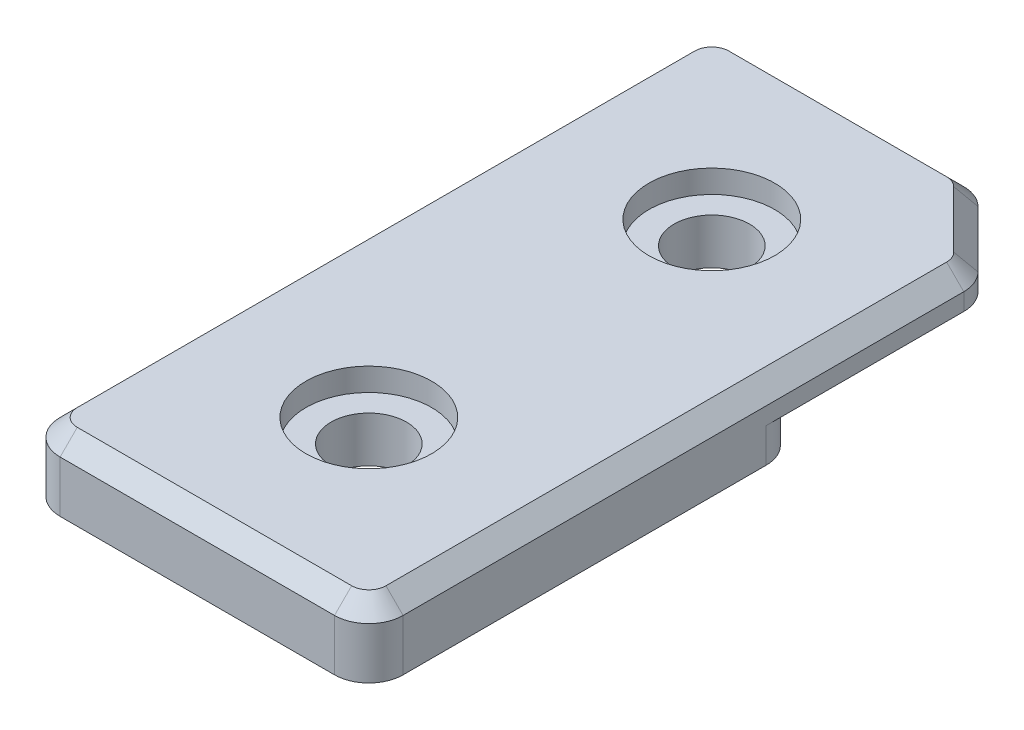
ISO-10303-21;
HEADER;
FILE_DESCRIPTION(('STEP AP214'),'2;1');
FILE_NAME('part.step','',(''),(''),'','','');
FILE_SCHEMA(('AUTOMOTIVE_DESIGN { 1 0 10303 214 1 1 1 1 }'));
ENDSEC;
DATA;
#1=APPLICATION_CONTEXT('core data for automotive mechanical design processes');
#2=APPLICATION_PROTOCOL_DEFINITION('international standard','automotive_design',2000,#1);
#3=PRODUCT_CONTEXT('',#1,'mechanical');
#4=PRODUCT('Part','Part','',(#3));
#5=PRODUCT_RELATED_PRODUCT_CATEGORY('part','',(#4));
#6=PRODUCT_DEFINITION_FORMATION('','',#4);
#7=PRODUCT_DEFINITION_CONTEXT('part definition',#1,'design');
#8=PRODUCT_DEFINITION('design','',#6,#7);
#9=PRODUCT_DEFINITION_SHAPE('','',#8);
#10=(LENGTH_UNIT() NAMED_UNIT(*) SI_UNIT(.MILLI.,.METRE.));
#11=(NAMED_UNIT(*) PLANE_ANGLE_UNIT() SI_UNIT($,.RADIAN.));
#12=(NAMED_UNIT(*) SI_UNIT($,.STERADIAN.) SOLID_ANGLE_UNIT());
#13=UNCERTAINTY_MEASURE_WITH_UNIT(LENGTH_MEASURE(1.E-05),#10,'distance_accuracy_value','');
#14=(GEOMETRIC_REPRESENTATION_CONTEXT(3) GLOBAL_UNCERTAINTY_ASSIGNED_CONTEXT((#13)) GLOBAL_UNIT_ASSIGNED_CONTEXT((#10,
#11,#12)) REPRESENTATION_CONTEXT('',''));
#15=CARTESIAN_POINT('',(0.,0.,0.));
#16=DIRECTION('',(0.,0.,1.));
#17=DIRECTION('',(1.,0.,0.));
#18=AXIS2_PLACEMENT_3D('',#15,#16,#17);
#19=CARTESIAN_POINT('',(15.,6.,-30.));
#20=DIRECTION('',(-1.,0.,0.));
#21=DIRECTION('',(0.,0.,1.));
#22=AXIS2_PLACEMENT_3D('',#19,#20,#21);
#23=PLANE('',#22);
#24=DIRECTION('',(0.,-1.,0.));
#25=VECTOR('',#24,1.);
#26=CARTESIAN_POINT('',(15.,6.,-22.0398448916085));
#27=LINE('',#26,#25);
#28=CARTESIAN_POINT('',(15.,3.,-22.0398448916085));
#29=VERTEX_POINT('',#28);
#30=CARTESIAN_POINT('',(15.,4.50000000000001,-22.0398448916085));
#31=VERTEX_POINT('',#30);
#32=EDGE_CURVE('E225',#29,#31,#27,.F.);
#33=ORIENTED_EDGE('',*,*,#32,.T.);
#34=DIRECTION('',(0.,0.,1.));
#35=VECTOR('',#34,1.);
#36=CARTESIAN_POINT('',(15.,4.50000000000001,27.));
#37=LINE('',#36,#35);
#38=CARTESIAN_POINT('',(15.,4.50000000000001,27.));
#39=VERTEX_POINT('',#38);
#40=EDGE_CURVE('E291',#31,#39,#37,.T.);
#41=ORIENTED_EDGE('',*,*,#40,.T.);
#42=DIRECTION('',(0.,-1.,0.));
#43=VECTOR('',#42,1.);
#44=CARTESIAN_POINT('',(15.,6.,27.));
#45=LINE('',#44,#43);
#46=CARTESIAN_POINT('',(15.,0.,27.));
#47=VERTEX_POINT('',#46);
#48=EDGE_CURVE('E180',#39,#47,#45,.T.);
#49=ORIENTED_EDGE('',*,*,#48,.T.);
#50=DIRECTION('',(0.,0.,-1.));
#51=VECTOR('',#50,1.);
#52=CARTESIAN_POINT('',(15.,0.,-30.));
#53=LINE('',#52,#51);
#54=CARTESIAN_POINT('',(15.,0.,-4.75735931288071));
#55=VERTEX_POINT('',#54);
#56=EDGE_CURVE('E206',#47,#55,#53,.T.);
#57=ORIENTED_EDGE('',*,*,#56,.T.);
#58=DIRECTION('',(0.,-1.,0.));
#59=VECTOR('',#58,1.);
#60=CARTESIAN_POINT('',(15.,6.,-4.75735931288071));
#61=LINE('',#60,#59);
#62=CARTESIAN_POINT('',(15.,3.,-4.75735931288071));
#63=VERTEX_POINT('',#62);
#64=EDGE_CURVE('E175',#55,#63,#61,.F.);
#65=ORIENTED_EDGE('',*,*,#64,.T.);
#66=DIRECTION('',(0.,0.,1.));
#67=VECTOR('',#66,1.);
#68=CARTESIAN_POINT('',(15.,3.,-30.));
#69=LINE('',#68,#67);
#70=EDGE_CURVE('E196',#29,#63,#69,.T.);
#71=ORIENTED_EDGE('',*,*,#70,.F.);
#72=EDGE_LOOP('',(#33,#41,#49,#57,#65,#71));
#73=FACE_BOUND('',#72,.T.);
#74=ADVANCED_FACE('F35',(#73),#23,.F.);
#75=CARTESIAN_POINT('',(-15.,6.,-30.));
#76=DIRECTION('',(0.,0.,1.));
#77=DIRECTION('',(1.,0.,0.));
#78=AXIS2_PLACEMENT_3D('',#75,#76,#77);
#79=PLANE('',#78);
#80=DIRECTION('',(0.,-1.,0.));
#81=VECTOR('',#80,1.);
#82=CARTESIAN_POINT('',(-12.,6.,-30.));
#83=LINE('',#82,#81);
#84=CARTESIAN_POINT('',(-12.,0.,-30.));
#85=VERTEX_POINT('',#84);
#86=CARTESIAN_POINT('',(-12.,4.50000000000001,-30.));
#87=VERTEX_POINT('',#86);
#88=EDGE_CURVE('E231',#85,#87,#83,.F.);
#89=ORIENTED_EDGE('',*,*,#88,.T.);
#90=DIRECTION('',(1.,0.,0.));
#91=VECTOR('',#90,1.);
#92=CARTESIAN_POINT('',(7.03984489160851,4.50000000000001,-30.));
#93=LINE('',#92,#91);
#94=CARTESIAN_POINT('',(7.03984489160851,4.50000000000001,-30.));
#95=VERTEX_POINT('',#94);
#96=EDGE_CURVE('E283',#87,#95,#93,.T.);
#97=ORIENTED_EDGE('',*,*,#96,.T.);
#98=DIRECTION('',(0.,-1.,0.));
#99=VECTOR('',#98,1.);
#100=CARTESIAN_POINT('',(7.03984489160851,6.,-30.));
#101=LINE('',#100,#99);
#102=CARTESIAN_POINT('',(7.03984489160851,3.,-30.));
#103=VERTEX_POINT('',#102);
#104=EDGE_CURVE('E229',#95,#103,#101,.T.);
#105=ORIENTED_EDGE('',*,*,#104,.T.);
#106=DIRECTION('',(1.,0.,0.));
#107=VECTOR('',#106,1.);
#108=CARTESIAN_POINT('',(-9.00000000000001,3.,-30.));
#109=LINE('',#108,#107);
#110=CARTESIAN_POINT('',(-10.2426406871193,3.,-30.));
#111=VERTEX_POINT('',#110);
#112=EDGE_CURVE('E204',#111,#103,#109,.T.);
#113=ORIENTED_EDGE('',*,*,#112,.F.);
#114=DIRECTION('',(0.,-1.,0.));
#115=VECTOR('',#114,1.);
#116=CARTESIAN_POINT('',(-10.2426406871193,6.,-30.));
#117=LINE('',#116,#115);
#118=CARTESIAN_POINT('',(-10.2426406871193,0.,-30.));
#119=VERTEX_POINT('',#118);
#120=EDGE_CURVE('E234',#111,#119,#117,.T.);
#121=ORIENTED_EDGE('',*,*,#120,.T.);
#122=DIRECTION('',(-1.,0.,0.));
#123=VECTOR('',#122,1.);
#124=CARTESIAN_POINT('',(-15.,0.,-30.));
#125=LINE('',#124,#123);
#126=EDGE_CURVE('E208',#119,#85,#125,.T.);
#127=ORIENTED_EDGE('',*,*,#126,.T.);
#128=EDGE_LOOP('',(#89,#97,#105,#113,#121,#127));
#129=FACE_BOUND('',#128,.T.);
#130=ADVANCED_FACE('F402',(#129),#79,.F.);
#131=CARTESIAN_POINT('',(-15.,6.,-30.));
#132=DIRECTION('',(1.,0.,0.));
#133=DIRECTION('',(0.,0.,-1.));
#134=AXIS2_PLACEMENT_3D('',#131,#132,#133);
#135=PLANE('',#134);
#136=DIRECTION('',(0.,-1.,0.));
#137=VECTOR('',#136,1.);
#138=CARTESIAN_POINT('',(-15.,6.,27.));
#139=LINE('',#138,#137);
#140=CARTESIAN_POINT('',(-15.,0.,27.));
#141=VERTEX_POINT('',#140);
#142=CARTESIAN_POINT('',(-15.,4.50000000000001,27.));
#143=VERTEX_POINT('',#142);
#144=EDGE_CURVE('E243',#141,#143,#139,.F.);
#145=ORIENTED_EDGE('',*,*,#144,.T.);
#146=DIRECTION('',(0.,0.,-1.));
#147=VECTOR('',#146,1.);
#148=CARTESIAN_POINT('',(-15.,4.50000000000001,-27.));
#149=LINE('',#148,#147);
#150=CARTESIAN_POINT('',(-15.,4.50000000000001,-27.));
#151=VERTEX_POINT('',#150);
#152=EDGE_CURVE('E11',#143,#151,#149,.T.);
#153=ORIENTED_EDGE('',*,*,#152,.T.);
#154=DIRECTION('',(0.,-1.,0.));
#155=VECTOR('',#154,1.);
#156=CARTESIAN_POINT('',(-15.,6.,-27.));
#157=LINE('',#156,#155);
#158=CARTESIAN_POINT('',(-15.,0.,-27.));
#159=VERTEX_POINT('',#158);
#160=EDGE_CURVE('E241',#151,#159,#157,.T.);
#161=ORIENTED_EDGE('',*,*,#160,.T.);
#162=DIRECTION('',(0.,0.,1.));
#163=VECTOR('',#162,1.);
#164=CARTESIAN_POINT('',(-15.,0.,-30.));
#165=LINE('',#164,#163);
#166=EDGE_CURVE('E211',#159,#141,#165,.T.);
#167=ORIENTED_EDGE('',*,*,#166,.T.);
#168=EDGE_LOOP('',(#145,#153,#161,#167));
#169=FACE_BOUND('',#168,.T.);
#170=ADVANCED_FACE('F387',(#169),#135,.F.);
#171=CARTESIAN_POINT('',(-15.,6.,30.));
#172=DIRECTION('',(0.,0.,-1.));
#173=DIRECTION('',(-1.,0.,0.));
#174=AXIS2_PLACEMENT_3D('',#171,#172,#173);
#175=PLANE('',#174);
#176=DIRECTION('',(0.,-1.,0.));
#177=VECTOR('',#176,1.);
#178=CARTESIAN_POINT('',(12.,6.,30.));
#179=LINE('',#178,#177);
#180=CARTESIAN_POINT('',(12.,0.,30.));
#181=VERTEX_POINT('',#180);
#182=CARTESIAN_POINT('',(12.,4.50000000000001,30.));
#183=VERTEX_POINT('',#182);
#184=EDGE_CURVE('E237',#181,#183,#179,.F.);
#185=ORIENTED_EDGE('',*,*,#184,.T.);
#186=DIRECTION('',(-1.,0.,0.));
#187=VECTOR('',#186,1.);
#188=CARTESIAN_POINT('',(-12.,4.50000000000001,30.));
#189=LINE('',#188,#187);
#190=CARTESIAN_POINT('',(-12.,4.50000000000001,30.));
#191=VERTEX_POINT('',#190);
#192=EDGE_CURVE('E60',#183,#191,#189,.T.);
#193=ORIENTED_EDGE('',*,*,#192,.T.);
#194=DIRECTION('',(0.,-1.,0.));
#195=VECTOR('',#194,1.);
#196=CARTESIAN_POINT('',(-12.,6.,30.));
#197=LINE('',#196,#195);
#198=CARTESIAN_POINT('',(-12.,0.,30.));
#199=VERTEX_POINT('',#198);
#200=EDGE_CURVE('E239',#191,#199,#197,.T.);
#201=ORIENTED_EDGE('',*,*,#200,.T.);
#202=DIRECTION('',(1.,0.,0.));
#203=VECTOR('',#202,1.);
#204=CARTESIAN_POINT('',(-15.,0.,30.));
#205=LINE('',#204,#203);
#206=EDGE_CURVE('E214',#199,#181,#205,.T.);
#207=ORIENTED_EDGE('',*,*,#206,.T.);
#208=EDGE_LOOP('',(#185,#193,#201,#207));
#209=FACE_BOUND('',#208,.T.);
#210=ADVANCED_FACE('F436',(#209),#175,.F.);
#211=CARTESIAN_POINT('',(0.,6.,0.));
#212=DIRECTION('',(0.,1.,0.));
#213=DIRECTION('',(0.,0.,1.));
#214=AXIS2_PLACEMENT_3D('',#211,#212,#213);
#215=PLANE('',#214);
#216=CARTESIAN_POINT('',(0.,6.,15.));
#217=DIRECTION('',(0.,1.,0.));
#218=DIRECTION('',(0.,0.,1.));
#219=AXIS2_PLACEMENT_3D('',#216,#217,#218);
#220=CIRCLE('',#219,5.5);
#221=CARTESIAN_POINT('',(0.,6.,20.5));
#222=VERTEX_POINT('',#221);
#223=EDGE_CURVE('E428',#222,#222,#220,.T.);
#224=ORIENTED_EDGE('',*,*,#223,.F.);
#225=EDGE_LOOP('',(#224));
#226=FACE_BOUND('',#225,.T.);
#227=CARTESIAN_POINT('',(0.,6.,-15.));
#228=DIRECTION('',(0.,1.,0.));
#229=DIRECTION('',(0.,0.,1.));
#230=AXIS2_PLACEMENT_3D('',#227,#228,#229);
#231=CIRCLE('',#230,5.5);
#232=CARTESIAN_POINT('',(0.,6.,-9.5));
#233=VERTEX_POINT('',#232);
#234=EDGE_CURVE('E416',#233,#233,#231,.T.);
#235=ORIENTED_EDGE('',*,*,#234,.F.);
#236=EDGE_LOOP('',(#235));
#237=FACE_BOUND('',#236,.T.);
#238=DIRECTION('',(-1.,0.,0.));
#239=VECTOR('',#238,1.);
#240=CARTESIAN_POINT('',(-12.,6.,-28.5));
#241=LINE('',#240,#239);
#242=CARTESIAN_POINT('',(7.03984489160851,6.,-28.5));
#243=VERTEX_POINT('',#242);
#244=CARTESIAN_POINT('',(-12.,6.,-28.5));
#245=VERTEX_POINT('',#244);
#246=EDGE_CURVE('E275',#243,#245,#241,.T.);
#247=ORIENTED_EDGE('',*,*,#246,.T.);
#248=CARTESIAN_POINT('',(-12.,6.,-27.));
#249=DIRECTION('',(0.,1.,0.));
#250=DIRECTION('',(0.,0.,1.));
#251=AXIS2_PLACEMENT_3D('',#248,#249,#250);
#252=CIRCLE('',#251,1.50000000000002);
#253=CARTESIAN_POINT('',(-13.5,6.,-27.));
#254=VERTEX_POINT('',#253);
#255=EDGE_CURVE('E277',#245,#254,#252,.T.);
#256=ORIENTED_EDGE('',*,*,#255,.T.);
#257=DIRECTION('',(0.,0.,1.));
#258=VECTOR('',#257,1.);
#259=CARTESIAN_POINT('',(-13.5,6.,27.));
#260=LINE('',#259,#258);
#261=CARTESIAN_POINT('',(-13.5,6.,27.));
#262=VERTEX_POINT('',#261);
#263=EDGE_CURVE('E259',#254,#262,#260,.T.);
#264=ORIENTED_EDGE('',*,*,#263,.T.);
#265=CARTESIAN_POINT('',(-12.,6.,27.));
#266=DIRECTION('',(0.,1.,0.));
#267=DIRECTION('',(0.,0.,1.));
#268=AXIS2_PLACEMENT_3D('',#265,#266,#267);
#269=CIRCLE('',#268,1.50000000000002);
#270=CARTESIAN_POINT('',(-12.,6.,28.5));
#271=VERTEX_POINT('',#270);
#272=EDGE_CURVE('E261',#262,#271,#269,.T.);
#273=ORIENTED_EDGE('',*,*,#272,.T.);
#274=DIRECTION('',(1.,0.,0.));
#275=VECTOR('',#274,1.);
#276=CARTESIAN_POINT('',(12.,6.,28.5));
#277=LINE('',#276,#275);
#278=CARTESIAN_POINT('',(12.,6.,28.5));
#279=VERTEX_POINT('',#278);
#280=EDGE_CURVE('E263',#271,#279,#277,.T.);
#281=ORIENTED_EDGE('',*,*,#280,.T.);
#282=CARTESIAN_POINT('',(12.,6.,27.));
#283=DIRECTION('',(0.,1.,0.));
#284=DIRECTION('',(0.,0.,1.));
#285=AXIS2_PLACEMENT_3D('',#282,#283,#284);
#286=CIRCLE('',#285,1.50000000000002);
#287=CARTESIAN_POINT('',(13.5,6.,27.));
#288=VERTEX_POINT('',#287);
#289=EDGE_CURVE('E265',#279,#288,#286,.T.);
#290=ORIENTED_EDGE('',*,*,#289,.T.);
#291=DIRECTION('',(0.,0.,-1.));
#292=VECTOR('',#291,1.);
#293=CARTESIAN_POINT('',(13.5,6.,-22.0398448916085));
#294=LINE('',#293,#292);
#295=CARTESIAN_POINT('',(13.5,6.,-22.0398448916085));
#296=VERTEX_POINT('',#295);
#297=EDGE_CURVE('E267',#288,#296,#294,.T.);
#298=ORIENTED_EDGE('',*,*,#297,.T.);
#299=CARTESIAN_POINT('',(12.,6.,-22.0398448916085));
#300=DIRECTION('',(0.,1.,0.));
#301=DIRECTION('',(0.,0.,1.));
#302=AXIS2_PLACEMENT_3D('',#299,#300,#301);
#303=CIRCLE('',#302,1.50000000000002);
#304=CARTESIAN_POINT('',(13.0606601717798,6.,-23.1005050633883));
#305=VERTEX_POINT('',#304);
#306=EDGE_CURVE('E269',#296,#305,#303,.T.);
#307=ORIENTED_EDGE('',*,*,#306,.T.);
#308=DIRECTION('',(-0.707106781186548,0.,-0.707106781186547));
#309=VECTOR('',#308,1.);
#310=CARTESIAN_POINT('',(8.10050506338834,6.,-28.0606601717798));
#311=LINE('',#310,#309);
#312=CARTESIAN_POINT('',(8.10050506338834,6.,-28.0606601717798));
#313=VERTEX_POINT('',#312);
#314=EDGE_CURVE('E271',#305,#313,#311,.T.);
#315=ORIENTED_EDGE('',*,*,#314,.T.);
#316=CARTESIAN_POINT('',(7.03984489160851,6.,-27.));
#317=DIRECTION('',(0.,1.,0.));
#318=DIRECTION('',(0.,0.,1.));
#319=AXIS2_PLACEMENT_3D('',#316,#317,#318);
#320=CIRCLE('',#319,1.50000000000002);
#321=EDGE_CURVE('E273',#313,#243,#320,.T.);
#322=ORIENTED_EDGE('',*,*,#321,.T.);
#323=EDGE_LOOP('',(#247,#256,#264,#273,#281,#290,#298,#307,#315,#322));
#324=FACE_BOUND('',#323,.T.);
#325=ADVANCED_FACE('F368',(#226,#237,#324),#215,.T.);
#326=CARTESIAN_POINT('',(0.,0.,0.));
#327=DIRECTION('',(0.,1.,0.));
#328=DIRECTION('',(0.,0.,1.));
#329=AXIS2_PLACEMENT_3D('',#326,#327,#328);
#330=PLANE('',#329);
#331=CARTESIAN_POINT('',(0.,0.,15.));
#332=DIRECTION('',(0.,1.,0.));
#333=DIRECTION('',(0.,0.,1.));
#334=AXIS2_PLACEMENT_3D('',#331,#332,#333);
#335=CIRCLE('',#334,3.3);
#336=CARTESIAN_POINT('',(0.,0.,18.3));
#337=VERTEX_POINT('',#336);
#338=EDGE_CURVE('E419',#337,#337,#335,.T.);
#339=ORIENTED_EDGE('',*,*,#338,.T.);
#340=EDGE_LOOP('',(#339));
#341=FACE_BOUND('',#340,.T.);
#342=CARTESIAN_POINT('',(0.,0.,-15.));
#343=DIRECTION('',(0.,1.,0.));
#344=DIRECTION('',(0.,0.,1.));
#345=AXIS2_PLACEMENT_3D('',#342,#343,#344);
#346=CIRCLE('',#345,3.3);
#347=CARTESIAN_POINT('',(0.,0.,-11.7));
#348=VERTEX_POINT('',#347);
#349=EDGE_CURVE('E300',#348,#348,#346,.T.);
#350=ORIENTED_EDGE('',*,*,#349,.T.);
#351=EDGE_LOOP('',(#350));
#352=FACE_BOUND('',#351,.T.);
#353=DIRECTION('',(-0.707106781186548,0.,-0.707106781186547));
#354=VECTOR('',#353,1.);
#355=CARTESIAN_POINT('',(15.,0.,-6.));
#356=LINE('',#355,#354);
#357=CARTESIAN_POINT('',(14.1213203435596,0.,-6.87867965644036));
#358=VERTEX_POINT('',#357);
#359=CARTESIAN_POINT('',(-8.12132034355965,0.,-29.1213203435596));
#360=VERTEX_POINT('',#359);
#361=EDGE_CURVE('E187',#358,#360,#356,.T.);
#362=ORIENTED_EDGE('',*,*,#361,.F.);
#363=CARTESIAN_POINT('',(12.,0.,-4.75735931288071));
#364=DIRECTION('',(0.,1.,0.));
#365=DIRECTION('',(0.,0.,1.));
#366=AXIS2_PLACEMENT_3D('',#363,#364,#365);
#367=CIRCLE('',#366,3.);
#368=EDGE_CURVE('E169',#358,#55,#367,.F.);
#369=ORIENTED_EDGE('',*,*,#368,.T.);
#370=ORIENTED_EDGE('',*,*,#56,.F.);
#371=CARTESIAN_POINT('',(12.,0.,27.));
#372=DIRECTION('',(0.,1.,0.));
#373=DIRECTION('',(0.,0.,1.));
#374=AXIS2_PLACEMENT_3D('',#371,#372,#373);
#375=CIRCLE('',#374,3.);
#376=EDGE_CURVE('E191',#47,#181,#375,.F.);
#377=ORIENTED_EDGE('',*,*,#376,.T.);
#378=ORIENTED_EDGE('',*,*,#206,.F.);
#379=CARTESIAN_POINT('',(-12.,0.,27.));
#380=DIRECTION('',(0.,1.,0.));
#381=DIRECTION('',(0.,0.,1.));
#382=AXIS2_PLACEMENT_3D('',#379,#380,#381);
#383=CIRCLE('',#382,3.);
#384=EDGE_CURVE('E221',#199,#141,#383,.F.);
#385=ORIENTED_EDGE('',*,*,#384,.T.);
#386=ORIENTED_EDGE('',*,*,#166,.F.);
#387=CARTESIAN_POINT('',(-12.,0.,-27.));
#388=DIRECTION('',(0.,1.,0.));
#389=DIRECTION('',(0.,0.,1.));
#390=AXIS2_PLACEMENT_3D('',#387,#388,#389);
#391=CIRCLE('',#390,3.);
#392=EDGE_CURVE('E219',#159,#85,#391,.F.);
#393=ORIENTED_EDGE('',*,*,#392,.T.);
#394=ORIENTED_EDGE('',*,*,#126,.F.);
#395=CARTESIAN_POINT('',(-10.2426406871193,0.,-27.));
#396=DIRECTION('',(0.,1.,0.));
#397=DIRECTION('',(0.,0.,1.));
#398=AXIS2_PLACEMENT_3D('',#395,#396,#397);
#399=CIRCLE('',#398,3.);
#400=EDGE_CURVE('E181',#119,#360,#399,.F.);
#401=ORIENTED_EDGE('',*,*,#400,.T.);
#402=EDGE_LOOP('',(#362,#369,#370,#377,#378,#385,#386,#393,#394,#401));
#403=FACE_BOUND('',#402,.T.);
#404=ADVANCED_FACE('F194',(#341,#352,#403),#330,.F.);
#405=CARTESIAN_POINT('',(15.,3.,-6.));
#406=DIRECTION('',(-0.707106781186547,0.,0.707106781186548));
#407=DIRECTION('',(0.707106781186548,0.,0.707106781186547));
#408=AXIS2_PLACEMENT_3D('',#405,#406,#407);
#409=PLANE('',#408);
#410=DIRECTION('',(-0.707106781186548,0.,-0.707106781186547));
#411=VECTOR('',#410,1.);
#412=CARTESIAN_POINT('',(15.,3.,-6.));
#413=LINE('',#412,#411);
#414=CARTESIAN_POINT('',(14.1213203435596,3.,-6.87867965644036));
#415=VERTEX_POINT('',#414);
#416=CARTESIAN_POINT('',(-8.12132034355965,3.,-29.1213203435596));
#417=VERTEX_POINT('',#416);
#418=EDGE_CURVE('E190',#415,#417,#413,.T.);
#419=ORIENTED_EDGE('',*,*,#418,.F.);
#420=DIRECTION('',(0.,-1.,0.));
#421=VECTOR('',#420,1.);
#422=CARTESIAN_POINT('',(14.1213203435596,3.,-6.87867965644036));
#423=LINE('',#422,#421);
#424=EDGE_CURVE('E173',#415,#358,#423,.T.);
#425=ORIENTED_EDGE('',*,*,#424,.T.);
#426=ORIENTED_EDGE('',*,*,#361,.T.);
#427=DIRECTION('',(0.,-1.,0.));
#428=VECTOR('',#427,1.);
#429=CARTESIAN_POINT('',(-8.12132034355965,3.,-29.1213203435596));
#430=LINE('',#429,#428);
#431=EDGE_CURVE('E192',#360,#417,#430,.F.);
#432=ORIENTED_EDGE('',*,*,#431,.T.);
#433=EDGE_LOOP('',(#419,#425,#426,#432));
#434=FACE_BOUND('',#433,.T.);
#435=ADVANCED_FACE('F186',(#434),#409,.F.);
#436=CARTESIAN_POINT('',(0.,3.,0.));
#437=DIRECTION('',(0.,1.,0.));
#438=DIRECTION('',(0.,0.,1.));
#439=AXIS2_PLACEMENT_3D('',#436,#437,#438);
#440=PLANE('',#439);
#441=ORIENTED_EDGE('',*,*,#112,.T.);
#442=CARTESIAN_POINT('',(7.03984489160851,3.,-27.));
#443=DIRECTION('',(0.,1.,0.));
#444=DIRECTION('',(0.,0.,1.));
#445=AXIS2_PLACEMENT_3D('',#442,#443,#444);
#446=CIRCLE('',#445,3.);
#447=CARTESIAN_POINT('',(9.16116523516815,3.,-29.1213203435596));
#448=VERTEX_POINT('',#447);
#449=EDGE_CURVE('E247',#103,#448,#446,.F.);
#450=ORIENTED_EDGE('',*,*,#449,.T.);
#451=DIRECTION('',(-0.707106781186548,0.,-0.707106781186547));
#452=VECTOR('',#451,1.);
#453=CARTESIAN_POINT('',(8.2824855787278,3.,-30.));
#454=LINE('',#453,#452);
#455=CARTESIAN_POINT('',(14.1213203435596,3.,-24.1611652351682));
#456=VERTEX_POINT('',#455);
#457=EDGE_CURVE('E197',#456,#448,#454,.T.);
#458=ORIENTED_EDGE('',*,*,#457,.F.);
#459=CARTESIAN_POINT('',(12.,3.,-22.0398448916085));
#460=DIRECTION('',(0.,1.,0.));
#461=DIRECTION('',(0.,0.,1.));
#462=AXIS2_PLACEMENT_3D('',#459,#460,#461);
#463=CIRCLE('',#462,3.);
#464=EDGE_CURVE('E245',#456,#29,#463,.F.);
#465=ORIENTED_EDGE('',*,*,#464,.T.);
#466=ORIENTED_EDGE('',*,*,#70,.T.);
#467=CARTESIAN_POINT('',(12.,3.,-4.75735931288071));
#468=DIRECTION('',(0.,1.,0.));
#469=DIRECTION('',(0.,0.,1.));
#470=AXIS2_PLACEMENT_3D('',#467,#468,#469);
#471=CIRCLE('',#470,3.);
#472=EDGE_CURVE('E254',#63,#415,#471,.T.);
#473=ORIENTED_EDGE('',*,*,#472,.T.);
#474=ORIENTED_EDGE('',*,*,#418,.T.);
#475=CARTESIAN_POINT('',(-10.2426406871193,3.,-27.));
#476=DIRECTION('',(0.,1.,0.));
#477=DIRECTION('',(0.,0.,1.));
#478=AXIS2_PLACEMENT_3D('',#475,#476,#477);
#479=CIRCLE('',#478,3.);
#480=EDGE_CURVE('E256',#417,#111,#479,.T.);
#481=ORIENTED_EDGE('',*,*,#480,.T.);
#482=EDGE_LOOP('',(#441,#450,#458,#465,#466,#473,#474,#481));
#483=FACE_BOUND('',#482,.T.);
#484=ADVANCED_FACE('F346',(#483),#440,.F.);
#485=CARTESIAN_POINT('',(8.2824855787278,6.,-30.));
#486=DIRECTION('',(-0.707106781186547,0.,0.707106781186548));
#487=DIRECTION('',(0.707106781186548,0.,0.707106781186547));
#488=AXIS2_PLACEMENT_3D('',#485,#486,#487);
#489=PLANE('',#488);
#490=DIRECTION('',(0.,-1.,0.));
#491=VECTOR('',#490,1.);
#492=CARTESIAN_POINT('',(9.16116523516815,6.,-29.1213203435596));
#493=LINE('',#492,#491);
#494=CARTESIAN_POINT('',(9.16116523516815,4.50000000000001,-29.1213203435596));
#495=VERTEX_POINT('',#494);
#496=EDGE_CURVE('E251',#448,#495,#493,.F.);
#497=ORIENTED_EDGE('',*,*,#496,.T.);
#498=DIRECTION('',(0.707106781186548,0.,0.707106781186547));
#499=VECTOR('',#498,1.);
#500=CARTESIAN_POINT('',(14.1213203435596,4.50000000000001,-24.1611652351682));
#501=LINE('',#500,#499);
#502=CARTESIAN_POINT('',(14.1213203435596,4.50000000000001,-24.1611652351682));
#503=VERTEX_POINT('',#502);
#504=EDGE_CURVE('E287',#495,#503,#501,.T.);
#505=ORIENTED_EDGE('',*,*,#504,.T.);
#506=DIRECTION('',(0.,-1.,0.));
#507=VECTOR('',#506,1.);
#508=CARTESIAN_POINT('',(14.1213203435596,6.,-24.1611652351682));
#509=LINE('',#508,#507);
#510=EDGE_CURVE('E249',#503,#456,#509,.T.);
#511=ORIENTED_EDGE('',*,*,#510,.T.);
#512=ORIENTED_EDGE('',*,*,#457,.T.);
#513=EDGE_LOOP('',(#497,#505,#511,#512));
#514=FACE_BOUND('',#513,.T.);
#515=ADVANCED_FACE('F354',(#514),#489,.F.);
#516=CARTESIAN_POINT('',(12.,3.,-4.75735931288071));
#517=DIRECTION('',(0.,-1.,0.));
#518=DIRECTION('',(0.,0.,-1.));
#519=AXIS2_PLACEMENT_3D('',#516,#517,#518);
#520=CYLINDRICAL_SURFACE('',#519,3.);
#521=ORIENTED_EDGE('',*,*,#472,.F.);
#522=ORIENTED_EDGE('',*,*,#64,.F.);
#523=ORIENTED_EDGE('',*,*,#368,.F.);
#524=ORIENTED_EDGE('',*,*,#424,.F.);
#525=EDGE_LOOP('',(#521,#522,#523,#524));
#526=FACE_BOUND('',#525,.T.);
#527=ADVANCED_FACE('F172',(#526),#520,.T.);
#528=CARTESIAN_POINT('',(-10.2426406871193,6.,-27.));
#529=DIRECTION('',(0.,-1.,0.));
#530=DIRECTION('',(0.,0.,-1.));
#531=AXIS2_PLACEMENT_3D('',#528,#529,#530);
#532=CYLINDRICAL_SURFACE('',#531,3.);
#533=ORIENTED_EDGE('',*,*,#480,.F.);
#534=ORIENTED_EDGE('',*,*,#431,.F.);
#535=ORIENTED_EDGE('',*,*,#400,.F.);
#536=ORIENTED_EDGE('',*,*,#120,.F.);
#537=EDGE_LOOP('',(#533,#534,#535,#536));
#538=FACE_BOUND('',#537,.T.);
#539=ADVANCED_FACE('F467',(#538),#532,.T.);
#540=CARTESIAN_POINT('',(-12.,6.,27.));
#541=DIRECTION('',(0.,-1.,0.));
#542=DIRECTION('',(0.,0.,-1.));
#543=AXIS2_PLACEMENT_3D('',#540,#541,#542);
#544=CYLINDRICAL_SURFACE('',#543,3.);
#545=ORIENTED_EDGE('',*,*,#200,.F.);
#546=CARTESIAN_POINT('',(-12.,4.50000000000001,27.));
#547=DIRECTION('',(0.,1.,0.));
#548=DIRECTION('',(0.,0.,1.));
#549=AXIS2_PLACEMENT_3D('',#546,#547,#548);
#550=CIRCLE('',#549,3.);
#551=EDGE_CURVE('E45',#191,#143,#550,.F.);
#552=ORIENTED_EDGE('',*,*,#551,.T.);
#553=ORIENTED_EDGE('',*,*,#144,.F.);
#554=ORIENTED_EDGE('',*,*,#384,.F.);
#555=EDGE_LOOP('',(#545,#552,#553,#554));
#556=FACE_BOUND('',#555,.T.);
#557=ADVANCED_FACE('F470',(#556),#544,.T.);
#558=CARTESIAN_POINT('',(-12.,6.,-27.));
#559=DIRECTION('',(0.,-1.,0.));
#560=DIRECTION('',(0.,0.,-1.));
#561=AXIS2_PLACEMENT_3D('',#558,#559,#560);
#562=CYLINDRICAL_SURFACE('',#561,3.);
#563=ORIENTED_EDGE('',*,*,#160,.F.);
#564=CARTESIAN_POINT('',(-12.,4.50000000000001,-27.));
#565=DIRECTION('',(0.,1.,0.));
#566=DIRECTION('',(0.,0.,1.));
#567=AXIS2_PLACEMENT_3D('',#564,#565,#566);
#568=CIRCLE('',#567,3.);
#569=EDGE_CURVE('E280',#151,#87,#568,.F.);
#570=ORIENTED_EDGE('',*,*,#569,.T.);
#571=ORIENTED_EDGE('',*,*,#88,.F.);
#572=ORIENTED_EDGE('',*,*,#392,.F.);
#573=EDGE_LOOP('',(#563,#570,#571,#572));
#574=FACE_BOUND('',#573,.T.);
#575=ADVANCED_FACE('F391',(#574),#562,.T.);
#576=CARTESIAN_POINT('',(7.03984489160851,6.,-27.));
#577=DIRECTION('',(0.,-1.,0.));
#578=DIRECTION('',(0.,0.,-1.));
#579=AXIS2_PLACEMENT_3D('',#576,#577,#578);
#580=CYLINDRICAL_SURFACE('',#579,3.);
#581=ORIENTED_EDGE('',*,*,#104,.F.);
#582=CARTESIAN_POINT('',(7.03984489160851,4.50000000000001,-27.));
#583=DIRECTION('',(0.,1.,0.));
#584=DIRECTION('',(0.,0.,1.));
#585=AXIS2_PLACEMENT_3D('',#582,#583,#584);
#586=CIRCLE('',#585,3.);
#587=EDGE_CURVE('E285',#95,#495,#586,.F.);
#588=ORIENTED_EDGE('',*,*,#587,.T.);
#589=ORIENTED_EDGE('',*,*,#496,.F.);
#590=ORIENTED_EDGE('',*,*,#449,.F.);
#591=EDGE_LOOP('',(#581,#588,#589,#590));
#592=FACE_BOUND('',#591,.T.);
#593=ADVANCED_FACE('F405',(#592),#580,.T.);
#594=CARTESIAN_POINT('',(12.,6.,-22.0398448916085));
#595=DIRECTION('',(0.,-1.,0.));
#596=DIRECTION('',(0.,0.,-1.));
#597=AXIS2_PLACEMENT_3D('',#594,#595,#596);
#598=CYLINDRICAL_SURFACE('',#597,3.);
#599=ORIENTED_EDGE('',*,*,#510,.F.);
#600=CARTESIAN_POINT('',(12.,4.50000000000001,-22.0398448916085));
#601=DIRECTION('',(0.,1.,0.));
#602=DIRECTION('',(0.,0.,1.));
#603=AXIS2_PLACEMENT_3D('',#600,#601,#602);
#604=CIRCLE('',#603,3.);
#605=EDGE_CURVE('E289',#503,#31,#604,.F.);
#606=ORIENTED_EDGE('',*,*,#605,.T.);
#607=ORIENTED_EDGE('',*,*,#32,.F.);
#608=ORIENTED_EDGE('',*,*,#464,.F.);
#609=EDGE_LOOP('',(#599,#606,#607,#608));
#610=FACE_BOUND('',#609,.T.);
#611=ADVANCED_FACE('F352',(#610),#598,.T.);
#612=CARTESIAN_POINT('',(12.,6.,27.));
#613=DIRECTION('',(0.,-1.,0.));
#614=DIRECTION('',(0.,0.,-1.));
#615=AXIS2_PLACEMENT_3D('',#612,#613,#614);
#616=CYLINDRICAL_SURFACE('',#615,3.);
#617=ORIENTED_EDGE('',*,*,#48,.F.);
#618=CARTESIAN_POINT('',(12.,4.50000000000001,27.));
#619=DIRECTION('',(0.,1.,0.));
#620=DIRECTION('',(0.,0.,1.));
#621=AXIS2_PLACEMENT_3D('',#618,#619,#620);
#622=CIRCLE('',#621,3.);
#623=EDGE_CURVE('E293',#39,#183,#622,.F.);
#624=ORIENTED_EDGE('',*,*,#623,.T.);
#625=ORIENTED_EDGE('',*,*,#184,.F.);
#626=ORIENTED_EDGE('',*,*,#376,.F.);
#627=EDGE_LOOP('',(#617,#624,#625,#626));
#628=FACE_BOUND('',#627,.T.);
#629=ADVANCED_FACE('F341',(#628),#616,.T.);
#630=CARTESIAN_POINT('',(13.5,6.,0.));
#631=DIRECTION('',(0.707106781186549,0.707106781186546,0.));
#632=DIRECTION('',(0.,0.,1.));
#633=AXIS2_PLACEMENT_3D('',#630,#631,#632);
#634=PLANE('',#633);
#635=DIRECTION('',(-0.707106781186546,0.707106781186549,0.));
#636=VECTOR('',#635,1.);
#637=CARTESIAN_POINT('',(15.,4.50000000000001,27.));
#638=LINE('',#637,#636);
#639=EDGE_CURVE('E319',#39,#288,#638,.T.);
#640=ORIENTED_EDGE('',*,*,#639,.F.);
#641=ORIENTED_EDGE('',*,*,#40,.F.);
#642=DIRECTION('',(0.707106781186546,-0.707106781186549,0.));
#643=VECTOR('',#642,1.);
#644=CARTESIAN_POINT('',(13.5,6.,-22.0398448916085));
#645=LINE('',#644,#643);
#646=EDGE_CURVE('E40',#296,#31,#645,.T.);
#647=ORIENTED_EDGE('',*,*,#646,.F.);
#648=ORIENTED_EDGE('',*,*,#297,.F.);
#649=EDGE_LOOP('',(#640,#641,#647,#648));
#650=FACE_BOUND('',#649,.T.);
#651=ADVANCED_FACE('F38',(#650),#634,.T.);
#652=CARTESIAN_POINT('',(12.,6.,-22.0398448916085));
#653=DIRECTION('',(0.,-1.,0.));
#654=DIRECTION('',(0.,0.,-1.));
#655=AXIS2_PLACEMENT_3D('',#652,#653,#654);
#656=CONICAL_SURFACE('',#655,1.50000000000002,0.785398163397446);
#657=ORIENTED_EDGE('',*,*,#646,.T.);
#658=ORIENTED_EDGE('',*,*,#605,.F.);
#659=DIRECTION('',(0.499999999999999,-0.707106781186549,-0.499999999999998));
#660=VECTOR('',#659,1.);
#661=CARTESIAN_POINT('',(13.0606601717798,6.,-23.1005050633883));
#662=LINE('',#661,#660);
#663=EDGE_CURVE('E317',#305,#503,#662,.T.);
#664=ORIENTED_EDGE('',*,*,#663,.F.);
#665=ORIENTED_EDGE('',*,*,#306,.F.);
#666=EDGE_LOOP('',(#657,#658,#664,#665));
#667=FACE_BOUND('',#666,.T.);
#668=ADVANCED_FACE('F330',(#667),#656,.T.);
#669=CARTESIAN_POINT('',(12.,6.,27.));
#670=DIRECTION('',(0.,-1.,0.));
#671=DIRECTION('',(0.,0.,-1.));
#672=AXIS2_PLACEMENT_3D('',#669,#670,#671);
#673=CONICAL_SURFACE('',#672,1.50000000000002,0.785398163397446);
#674=ORIENTED_EDGE('',*,*,#639,.T.);
#675=ORIENTED_EDGE('',*,*,#289,.F.);
#676=DIRECTION('',(0.,0.707106781186549,-0.707106781186546));
#677=VECTOR('',#676,1.);
#678=CARTESIAN_POINT('',(12.,4.50000000000001,30.));
#679=LINE('',#678,#677);
#680=EDGE_CURVE('E314',#183,#279,#679,.T.);
#681=ORIENTED_EDGE('',*,*,#680,.F.);
#682=ORIENTED_EDGE('',*,*,#623,.F.);
#683=EDGE_LOOP('',(#674,#675,#681,#682));
#684=FACE_BOUND('',#683,.T.);
#685=ADVANCED_FACE('F372',(#684),#673,.T.);
#686=CARTESIAN_POINT('',(18.0805826175841,6.,-18.0805826175841));
#687=DIRECTION('',(0.500000000000001,0.707106781186546,-0.500000000000001));
#688=DIRECTION('',(0.707106781186548,0.,0.707106781186547));
#689=AXIS2_PLACEMENT_3D('',#686,#687,#688);
#690=PLANE('',#689);
#691=ORIENTED_EDGE('',*,*,#663,.T.);
#692=ORIENTED_EDGE('',*,*,#504,.F.);
#693=DIRECTION('',(0.499999999999999,-0.707106781186548,-0.499999999999999));
#694=VECTOR('',#693,1.);
#695=CARTESIAN_POINT('',(8.10050506338834,6.,-28.0606601717798));
#696=LINE('',#695,#694);
#697=EDGE_CURVE('E311',#313,#495,#696,.T.);
#698=ORIENTED_EDGE('',*,*,#697,.F.);
#699=ORIENTED_EDGE('',*,*,#314,.F.);
#700=EDGE_LOOP('',(#691,#692,#698,#699));
#701=FACE_BOUND('',#700,.T.);
#702=ADVANCED_FACE('F359',(#701),#690,.T.);
#703=CARTESIAN_POINT('',(0.,6.,28.5));
#704=DIRECTION('',(0.,0.707106781186546,0.707106781186549));
#705=DIRECTION('',(-1.,0.,0.));
#706=AXIS2_PLACEMENT_3D('',#703,#704,#705);
#707=PLANE('',#706);
#708=ORIENTED_EDGE('',*,*,#680,.T.);
#709=ORIENTED_EDGE('',*,*,#280,.F.);
#710=DIRECTION('',(0.,0.707106781186549,-0.707106781186546));
#711=VECTOR('',#710,1.);
#712=CARTESIAN_POINT('',(-12.,4.50000000000001,30.));
#713=LINE('',#712,#711);
#714=EDGE_CURVE('E308',#191,#271,#713,.T.);
#715=ORIENTED_EDGE('',*,*,#714,.F.);
#716=ORIENTED_EDGE('',*,*,#192,.F.);
#717=EDGE_LOOP('',(#708,#709,#715,#716));
#718=FACE_BOUND('',#717,.T.);
#719=ADVANCED_FACE('F374',(#718),#707,.T.);
#720=CARTESIAN_POINT('',(7.03984489160851,6.,-27.));
#721=DIRECTION('',(0.,-1.,0.));
#722=DIRECTION('',(0.,0.,-1.));
#723=AXIS2_PLACEMENT_3D('',#720,#721,#722);
#724=CONICAL_SURFACE('',#723,1.50000000000002,0.785398163397446);
#725=ORIENTED_EDGE('',*,*,#697,.T.);
#726=ORIENTED_EDGE('',*,*,#587,.F.);
#727=DIRECTION('',(0.,-0.707106781186549,-0.707106781186546));
#728=VECTOR('',#727,1.);
#729=CARTESIAN_POINT('',(7.03984489160851,6.,-28.5));
#730=LINE('',#729,#728);
#731=EDGE_CURVE('E305',#243,#95,#730,.T.);
#732=ORIENTED_EDGE('',*,*,#731,.F.);
#733=ORIENTED_EDGE('',*,*,#321,.F.);
#734=EDGE_LOOP('',(#725,#726,#732,#733));
#735=FACE_BOUND('',#734,.T.);
#736=ADVANCED_FACE('F364',(#735),#724,.T.);
#737=CARTESIAN_POINT('',(-12.,6.,27.));
#738=DIRECTION('',(0.,-1.,0.));
#739=DIRECTION('',(0.,0.,-1.));
#740=AXIS2_PLACEMENT_3D('',#737,#738,#739);
#741=CONICAL_SURFACE('',#740,1.50000000000002,0.785398163397446);
#742=ORIENTED_EDGE('',*,*,#714,.T.);
#743=ORIENTED_EDGE('',*,*,#272,.F.);
#744=DIRECTION('',(0.707106781186546,0.707106781186549,0.));
#745=VECTOR('',#744,1.);
#746=CARTESIAN_POINT('',(-15.,4.50000000000001,27.));
#747=LINE('',#746,#745);
#748=EDGE_CURVE('E302',#143,#262,#747,.T.);
#749=ORIENTED_EDGE('',*,*,#748,.F.);
#750=ORIENTED_EDGE('',*,*,#551,.F.);
#751=EDGE_LOOP('',(#742,#743,#749,#750));
#752=FACE_BOUND('',#751,.T.);
#753=ADVANCED_FACE('F379',(#752),#741,.T.);
#754=CARTESIAN_POINT('',(0.,6.,-28.5));
#755=DIRECTION('',(0.,0.707106781186546,-0.707106781186549));
#756=DIRECTION('',(1.,0.,0.));
#757=AXIS2_PLACEMENT_3D('',#754,#755,#756);
#758=PLANE('',#757);
#759=ORIENTED_EDGE('',*,*,#731,.T.);
#760=ORIENTED_EDGE('',*,*,#96,.F.);
#761=DIRECTION('',(0.,-0.707106781186549,-0.707106781186546));
#762=VECTOR('',#761,1.);
#763=CARTESIAN_POINT('',(-12.,6.,-28.5));
#764=LINE('',#763,#762);
#765=EDGE_CURVE('E299',#245,#87,#764,.T.);
#766=ORIENTED_EDGE('',*,*,#765,.F.);
#767=ORIENTED_EDGE('',*,*,#246,.F.);
#768=EDGE_LOOP('',(#759,#760,#766,#767));
#769=FACE_BOUND('',#768,.T.);
#770=ADVANCED_FACE('F399',(#769),#758,.T.);
#771=CARTESIAN_POINT('',(-13.5,6.,0.));
#772=DIRECTION('',(-0.707106781186549,0.707106781186546,0.));
#773=DIRECTION('',(0.,0.,-1.));
#774=AXIS2_PLACEMENT_3D('',#771,#772,#773);
#775=PLANE('',#774);
#776=ORIENTED_EDGE('',*,*,#748,.T.);
#777=ORIENTED_EDGE('',*,*,#263,.F.);
#778=DIRECTION('',(0.707106781186546,0.707106781186549,0.));
#779=VECTOR('',#778,1.);
#780=CARTESIAN_POINT('',(-15.,4.50000000000001,-27.));
#781=LINE('',#780,#779);
#782=EDGE_CURVE('E297',#151,#254,#781,.T.);
#783=ORIENTED_EDGE('',*,*,#782,.F.);
#784=ORIENTED_EDGE('',*,*,#152,.F.);
#785=EDGE_LOOP('',(#776,#777,#783,#784));
#786=FACE_BOUND('',#785,.T.);
#787=ADVANCED_FACE('F384',(#786),#775,.T.);
#788=CARTESIAN_POINT('',(-12.,6.,-27.));
#789=DIRECTION('',(0.,-1.,0.));
#790=DIRECTION('',(0.,0.,-1.));
#791=AXIS2_PLACEMENT_3D('',#788,#789,#790);
#792=CONICAL_SURFACE('',#791,1.50000000000002,0.785398163397446);
#793=ORIENTED_EDGE('',*,*,#765,.T.);
#794=ORIENTED_EDGE('',*,*,#569,.F.);
#795=ORIENTED_EDGE('',*,*,#782,.T.);
#796=ORIENTED_EDGE('',*,*,#255,.F.);
#797=EDGE_LOOP('',(#793,#794,#795,#796));
#798=FACE_BOUND('',#797,.T.);
#799=ADVANCED_FACE('F395',(#798),#792,.T.);
#800=CARTESIAN_POINT('',(0.,6.,-15.));
#801=DIRECTION('',(0.,1.,0.));
#802=DIRECTION('',(0.,0.,1.));
#803=AXIS2_PLACEMENT_3D('',#800,#801,#802);
#804=CYLINDRICAL_SURFACE('',#803,3.3);
#805=ORIENTED_EDGE('',*,*,#349,.F.);
#806=EDGE_LOOP('',(#805));
#807=FACE_BOUND('',#806,.T.);
#808=CARTESIAN_POINT('',(0.,4.,-15.));
#809=DIRECTION('',(0.,1.,0.));
#810=DIRECTION('',(0.,0.,1.));
#811=AXIS2_PLACEMENT_3D('',#808,#809,#810);
#812=CIRCLE('',#811,3.3);
#813=CARTESIAN_POINT('',(0.,4.,-11.7));
#814=VERTEX_POINT('',#813);
#815=EDGE_CURVE('E410',#814,#814,#812,.T.);
#816=ORIENTED_EDGE('',*,*,#815,.T.);
#817=EDGE_LOOP('',(#816));
#818=FACE_BOUND('',#817,.T.);
#819=ADVANCED_FACE('F453',(#807,#818),#804,.F.);
#820=CARTESIAN_POINT('',(3.29999999999999,4.,-15.));
#821=DIRECTION('',(0.,-1.,0.));
#822=DIRECTION('',(0.,0.,-1.));
#823=AXIS2_PLACEMENT_3D('',#820,#821,#822);
#824=PLANE('',#823);
#825=ORIENTED_EDGE('',*,*,#815,.F.);
#826=EDGE_LOOP('',(#825));
#827=FACE_BOUND('',#826,.T.);
#828=CARTESIAN_POINT('',(0.,4.,-15.));
#829=DIRECTION('',(0.,1.,0.));
#830=DIRECTION('',(0.,0.,1.));
#831=AXIS2_PLACEMENT_3D('',#828,#829,#830);
#832=CIRCLE('',#831,5.5);
#833=CARTESIAN_POINT('',(0.,4.,-9.5));
#834=VERTEX_POINT('',#833);
#835=EDGE_CURVE('E413',#834,#834,#832,.T.);
#836=ORIENTED_EDGE('',*,*,#835,.T.);
#837=EDGE_LOOP('',(#836));
#838=FACE_BOUND('',#837,.T.);
#839=ADVANCED_FACE('F443',(#827,#838),#824,.F.);
#840=CARTESIAN_POINT('',(0.,6.,-15.));
#841=DIRECTION('',(0.,1.,0.));
#842=DIRECTION('',(0.,0.,1.));
#843=AXIS2_PLACEMENT_3D('',#840,#841,#842);
#844=CYLINDRICAL_SURFACE('',#843,5.5);
#845=ORIENTED_EDGE('',*,*,#835,.F.);
#846=EDGE_LOOP('',(#845));
#847=FACE_BOUND('',#846,.T.);
#848=ORIENTED_EDGE('',*,*,#234,.T.);
#849=EDGE_LOOP('',(#848));
#850=FACE_BOUND('',#849,.T.);
#851=ADVANCED_FACE('F440',(#847,#850),#844,.F.);
#852=CARTESIAN_POINT('',(0.,6.,15.));
#853=DIRECTION('',(0.,1.,0.));
#854=DIRECTION('',(0.,0.,1.));
#855=AXIS2_PLACEMENT_3D('',#852,#853,#854);
#856=CYLINDRICAL_SURFACE('',#855,3.3);
#857=ORIENTED_EDGE('',*,*,#338,.F.);
#858=EDGE_LOOP('',(#857));
#859=FACE_BOUND('',#858,.T.);
#860=CARTESIAN_POINT('',(0.,4.,15.));
#861=DIRECTION('',(0.,1.,0.));
#862=DIRECTION('',(0.,0.,1.));
#863=AXIS2_PLACEMENT_3D('',#860,#861,#862);
#864=CIRCLE('',#863,3.3);
#865=CARTESIAN_POINT('',(0.,4.,18.3));
#866=VERTEX_POINT('',#865);
#867=EDGE_CURVE('E422',#866,#866,#864,.T.);
#868=ORIENTED_EDGE('',*,*,#867,.T.);
#869=EDGE_LOOP('',(#868));
#870=FACE_BOUND('',#869,.T.);
#871=ADVANCED_FACE('F442',(#859,#870),#856,.F.);
#872=CARTESIAN_POINT('',(3.3,4.,15.));
#873=DIRECTION('',(0.,-1.,0.));
#874=DIRECTION('',(0.,0.,-1.));
#875=AXIS2_PLACEMENT_3D('',#872,#873,#874);
#876=PLANE('',#875);
#877=ORIENTED_EDGE('',*,*,#867,.F.);
#878=EDGE_LOOP('',(#877));
#879=FACE_BOUND('',#878,.T.);
#880=CARTESIAN_POINT('',(0.,4.,15.));
#881=DIRECTION('',(0.,1.,0.));
#882=DIRECTION('',(0.,0.,1.));
#883=AXIS2_PLACEMENT_3D('',#880,#881,#882);
#884=CIRCLE('',#883,5.5);
#885=CARTESIAN_POINT('',(0.,4.,20.5));
#886=VERTEX_POINT('',#885);
#887=EDGE_CURVE('E425',#886,#886,#884,.T.);
#888=ORIENTED_EDGE('',*,*,#887,.T.);
#889=EDGE_LOOP('',(#888));
#890=FACE_BOUND('',#889,.T.);
#891=ADVANCED_FACE('F450',(#879,#890),#876,.F.);
#892=CARTESIAN_POINT('',(0.,6.,15.));
#893=DIRECTION('',(0.,1.,0.));
#894=DIRECTION('',(0.,0.,1.));
#895=AXIS2_PLACEMENT_3D('',#892,#893,#894);
#896=CYLINDRICAL_SURFACE('',#895,5.5);
#897=ORIENTED_EDGE('',*,*,#887,.F.);
#898=EDGE_LOOP('',(#897));
#899=FACE_BOUND('',#898,.T.);
#900=ORIENTED_EDGE('',*,*,#223,.T.);
#901=EDGE_LOOP('',(#900));
#902=FACE_BOUND('',#901,.T.);
#903=ADVANCED_FACE('F432',(#899,#902),#896,.F.);
#904=CLOSED_SHELL('',(#74,#130,#170,#210,#325,#404,#435,#484,#515,#527,#539,#557,#575,#593,#611,
#629,#651,#668,#685,#702,#719,#736,#753,#770,#787,#799,#819,#839,#851,#871,#891,#903));
#905=MANIFOLD_SOLID_BREP('B2',#904);
#906=ADVANCED_BREP_SHAPE_REPRESENTATION('',(#18,#905),#14);
#907=SHAPE_DEFINITION_REPRESENTATION(#9,#906);
ENDSEC;
END-ISO-10303-21;
